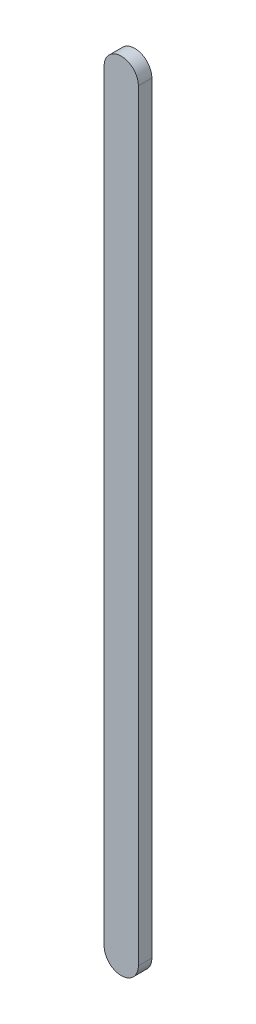
ISO-10303-21;
HEADER;
FILE_DESCRIPTION(('STEP AP214'),'2;1');
FILE_NAME('part.step','',(''),(''),'','','');
FILE_SCHEMA(('AUTOMOTIVE_DESIGN { 1 0 10303 214 1 1 1 1 }'));
ENDSEC;
DATA;
#1=APPLICATION_CONTEXT('core data for automotive mechanical design processes');
#2=APPLICATION_PROTOCOL_DEFINITION('international standard','automotive_design',2000,#1);
#3=PRODUCT_CONTEXT('',#1,'mechanical');
#4=PRODUCT('Part','Part','',(#3));
#5=PRODUCT_RELATED_PRODUCT_CATEGORY('part','',(#4));
#6=PRODUCT_DEFINITION_FORMATION('','',#4);
#7=PRODUCT_DEFINITION_CONTEXT('part definition',#1,'design');
#8=PRODUCT_DEFINITION('design','',#6,#7);
#9=PRODUCT_DEFINITION_SHAPE('','',#8);
#10=(LENGTH_UNIT() NAMED_UNIT(*) SI_UNIT(.MILLI.,.METRE.));
#11=(NAMED_UNIT(*) PLANE_ANGLE_UNIT() SI_UNIT($,.RADIAN.));
#12=(NAMED_UNIT(*) SI_UNIT($,.STERADIAN.) SOLID_ANGLE_UNIT());
#13=UNCERTAINTY_MEASURE_WITH_UNIT(LENGTH_MEASURE(1.E-05),#10,'distance_accuracy_value','');
#14=(GEOMETRIC_REPRESENTATION_CONTEXT(3) GLOBAL_UNCERTAINTY_ASSIGNED_CONTEXT((#13)) GLOBAL_UNIT_ASSIGNED_CONTEXT((#10,
#11,#12)) REPRESENTATION_CONTEXT('',''));
#15=CARTESIAN_POINT('',(0.,0.,0.));
#16=DIRECTION('',(0.,0.,1.));
#17=DIRECTION('',(1.,0.,0.));
#18=AXIS2_PLACEMENT_3D('',#15,#16,#17);
#19=CARTESIAN_POINT('',(100.965,102.8670028,0.));
#20=DIRECTION('',(-1.,0.,0.));
#21=DIRECTION('',(0.,1.,0.));
#22=AXIS2_PLACEMENT_3D('',#19,#20,#21);
#23=PLANE('',#22);
#24=DIRECTION('',(0.,1.,0.));
#25=VECTOR('',#24,1.);
#26=CARTESIAN_POINT('',(100.965,102.8670028,0.1999996));
#27=LINE('',#26,#25);
#28=CARTESIAN_POINT('',(100.965,102.8670028,0.1999996));
#29=VERTEX_POINT('',#28);
#30=CARTESIAN_POINT('',(100.965,114.176048,0.1999996));
#31=VERTEX_POINT('',#30);
#32=EDGE_CURVE('E11',#29,#31,#27,.T.);
#33=ORIENTED_EDGE('',*,*,#32,.F.);
#34=DIRECTION('',(0.,0.,1.));
#35=VECTOR('',#34,1.);
#36=CARTESIAN_POINT('',(100.965,102.8670028,0.));
#37=LINE('',#36,#35);
#38=CARTESIAN_POINT('',(100.965,102.8670028,0.));
#39=VERTEX_POINT('',#38);
#40=EDGE_CURVE('E24',#39,#29,#37,.T.);
#41=ORIENTED_EDGE('',*,*,#40,.F.);
#42=DIRECTION('',(0.,1.,0.));
#43=VECTOR('',#42,1.);
#44=CARTESIAN_POINT('',(100.965,102.8670028,0.));
#45=LINE('',#44,#43);
#46=CARTESIAN_POINT('',(100.965,114.176048,0.));
#47=VERTEX_POINT('',#46);
#48=EDGE_CURVE('E75',#39,#47,#45,.T.);
#49=ORIENTED_EDGE('',*,*,#48,.T.);
#50=DIRECTION('',(0.,0.,1.));
#51=VECTOR('',#50,1.);
#52=CARTESIAN_POINT('',(100.965,114.176048,0.));
#53=LINE('',#52,#51);
#54=EDGE_CURVE('E37',#47,#31,#53,.T.);
#55=ORIENTED_EDGE('',*,*,#54,.T.);
#56=EDGE_LOOP('',(#33,#41,#49,#55));
#57=FACE_BOUND('',#56,.T.);
#58=ADVANCED_FACE('F17',(#57),#23,.F.);
#59=CARTESIAN_POINT('',(100.711,114.176048,0.));
#60=DIRECTION('',(0.,0.,-1.));
#61=DIRECTION('',(1.,0.,0.));
#62=AXIS2_PLACEMENT_3D('',#59,#60,#61);
#63=CYLINDRICAL_SURFACE('',#62,0.254000000000005);
#64=CARTESIAN_POINT('',(100.711,114.176048,0.1999996));
#65=DIRECTION('',(0.,0.,1.));
#66=DIRECTION('',(1.,0.,0.));
#67=AXIS2_PLACEMENT_3D('',#64,#65,#66);
#68=CIRCLE('',#67,0.254000000000005);
#69=CARTESIAN_POINT('',(100.457,114.176048,0.1999996));
#70=VERTEX_POINT('',#69);
#71=EDGE_CURVE('E83',#31,#70,#68,.T.);
#72=ORIENTED_EDGE('',*,*,#71,.F.);
#73=ORIENTED_EDGE('',*,*,#54,.F.);
#74=CARTESIAN_POINT('',(100.711,114.176048,0.));
#75=DIRECTION('',(0.,0.,1.));
#76=DIRECTION('',(1.,0.,0.));
#77=AXIS2_PLACEMENT_3D('',#74,#75,#76);
#78=CIRCLE('',#77,0.254000000000005);
#79=CARTESIAN_POINT('',(100.457,114.176048,0.));
#80=VERTEX_POINT('',#79);
#81=EDGE_CURVE('E81',#47,#80,#78,.T.);
#82=ORIENTED_EDGE('',*,*,#81,.T.);
#83=DIRECTION('',(0.,0.,1.));
#84=VECTOR('',#83,1.);
#85=CARTESIAN_POINT('',(100.457,114.176048,0.));
#86=LINE('',#85,#84);
#87=EDGE_CURVE('E67',#80,#70,#86,.T.);
#88=ORIENTED_EDGE('',*,*,#87,.T.);
#89=EDGE_LOOP('',(#72,#73,#82,#88));
#90=FACE_BOUND('',#89,.T.);
#91=ADVANCED_FACE('F89',(#90),#63,.T.);
#92=CARTESIAN_POINT('',(100.457,114.176048,0.));
#93=DIRECTION('',(1.,0.,0.));
#94=DIRECTION('',(0.,-1.,0.));
#95=AXIS2_PLACEMENT_3D('',#92,#93,#94);
#96=PLANE('',#95);
#97=DIRECTION('',(0.,-1.,0.));
#98=VECTOR('',#97,1.);
#99=CARTESIAN_POINT('',(100.457,114.176048,0.1999996));
#100=LINE('',#99,#98);
#101=CARTESIAN_POINT('',(100.457,102.8670028,0.1999996));
#102=VERTEX_POINT('',#101);
#103=EDGE_CURVE('E71',#70,#102,#100,.T.);
#104=ORIENTED_EDGE('',*,*,#103,.F.);
#105=ORIENTED_EDGE('',*,*,#87,.F.);
#106=DIRECTION('',(0.,-1.,0.));
#107=VECTOR('',#106,1.);
#108=CARTESIAN_POINT('',(100.457,114.176048,0.));
#109=LINE('',#108,#107);
#110=CARTESIAN_POINT('',(100.457,102.8670028,0.));
#111=VERTEX_POINT('',#110);
#112=EDGE_CURVE('E63',#80,#111,#109,.T.);
#113=ORIENTED_EDGE('',*,*,#112,.T.);
#114=DIRECTION('',(0.,0.,1.));
#115=VECTOR('',#114,1.);
#116=CARTESIAN_POINT('',(100.457,102.8670028,0.));
#117=LINE('',#116,#115);
#118=EDGE_CURVE('E53',#111,#102,#117,.T.);
#119=ORIENTED_EDGE('',*,*,#118,.T.);
#120=EDGE_LOOP('',(#104,#105,#113,#119));
#121=FACE_BOUND('',#120,.T.);
#122=ADVANCED_FACE('F66',(#121),#96,.F.);
#123=CARTESIAN_POINT('',(100.711,102.8670028,0.));
#124=DIRECTION('',(0.,0.,-1.));
#125=DIRECTION('',(-1.,0.,0.));
#126=AXIS2_PLACEMENT_3D('',#123,#124,#125);
#127=CYLINDRICAL_SURFACE('',#126,0.254);
#128=CARTESIAN_POINT('',(100.711,102.8670028,0.1999996));
#129=DIRECTION('',(0.,0.,1.));
#130=DIRECTION('',(-1.,0.,0.));
#131=AXIS2_PLACEMENT_3D('',#128,#129,#130);
#132=CIRCLE('',#131,0.254);
#133=EDGE_CURVE('E59',#102,#29,#132,.T.);
#134=ORIENTED_EDGE('',*,*,#133,.F.);
#135=ORIENTED_EDGE('',*,*,#118,.F.);
#136=CARTESIAN_POINT('',(100.711,102.8670028,0.));
#137=DIRECTION('',(0.,0.,1.));
#138=DIRECTION('',(-1.,0.,0.));
#139=AXIS2_PLACEMENT_3D('',#136,#137,#138);
#140=CIRCLE('',#139,0.254);
#141=EDGE_CURVE('E57',#111,#39,#140,.T.);
#142=ORIENTED_EDGE('',*,*,#141,.T.);
#143=ORIENTED_EDGE('',*,*,#40,.T.);
#144=EDGE_LOOP('',(#134,#135,#142,#143));
#145=FACE_BOUND('',#144,.T.);
#146=ADVANCED_FACE('F55',(#145),#127,.T.);
#147=CARTESIAN_POINT('',(100.965,102.8670028,0.));
#148=DIRECTION('',(0.,0.,-1.));
#149=DIRECTION('',(-1.,0.,0.));
#150=AXIS2_PLACEMENT_3D('',#147,#148,#149);
#151=PLANE('',#150);
#152=ORIENTED_EDGE('',*,*,#141,.F.);
#153=ORIENTED_EDGE('',*,*,#112,.F.);
#154=ORIENTED_EDGE('',*,*,#81,.F.);
#155=ORIENTED_EDGE('',*,*,#48,.F.);
#156=EDGE_LOOP('',(#152,#153,#154,#155));
#157=FACE_BOUND('',#156,.T.);
#158=ADVANCED_FACE('F74',(#157),#151,.T.);
#159=CARTESIAN_POINT('',(100.965,102.8670028,0.1999996));
#160=DIRECTION('',(0.,0.,-1.));
#161=DIRECTION('',(-1.,0.,0.));
#162=AXIS2_PLACEMENT_3D('',#159,#160,#161);
#163=PLANE('',#162);
#164=ORIENTED_EDGE('',*,*,#32,.T.);
#165=ORIENTED_EDGE('',*,*,#71,.T.);
#166=ORIENTED_EDGE('',*,*,#103,.T.);
#167=ORIENTED_EDGE('',*,*,#133,.T.);
#168=EDGE_LOOP('',(#164,#165,#166,#167));
#169=FACE_BOUND('',#168,.T.);
#170=ADVANCED_FACE('F91',(#169),#163,.F.);
#171=CLOSED_SHELL('',(#58,#91,#122,#146,#158,#170));
#172=MANIFOLD_SOLID_BREP('B1',#171);
#173=ADVANCED_BREP_SHAPE_REPRESENTATION('',(#18,#172),#14);
#174=SHAPE_DEFINITION_REPRESENTATION(#9,#173);
ENDSEC;
END-ISO-10303-21;
